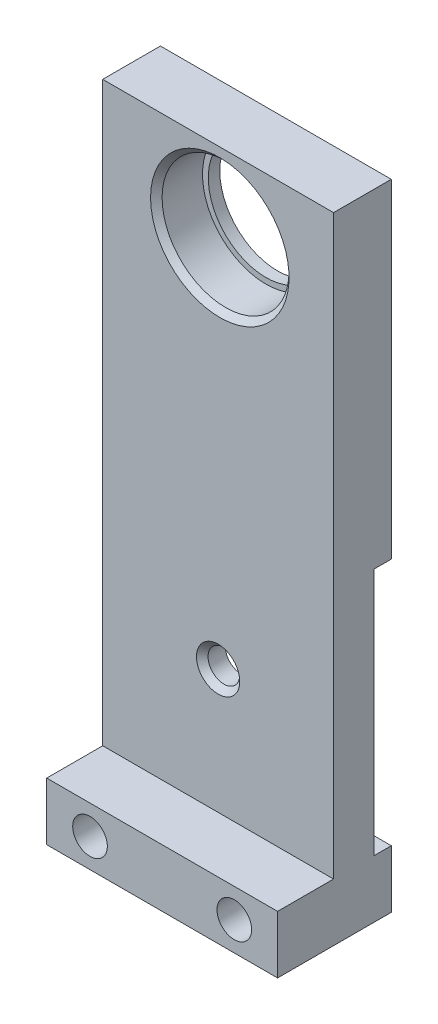
ISO-10303-21;
HEADER;
FILE_DESCRIPTION(('STEP AP214'),'2;1');
FILE_NAME('part.step','',(''),(''),'','','');
FILE_SCHEMA(('AUTOMOTIVE_DESIGN { 1 0 10303 214 1 1 1 1 }'));
ENDSEC;
DATA;
#1=APPLICATION_CONTEXT('core data for automotive mechanical design processes');
#2=APPLICATION_PROTOCOL_DEFINITION('international standard','automotive_design',2000,#1);
#3=PRODUCT_CONTEXT('',#1,'mechanical');
#4=PRODUCT('Part','Part','',(#3));
#5=PRODUCT_RELATED_PRODUCT_CATEGORY('part','',(#4));
#6=PRODUCT_DEFINITION_FORMATION('','',#4);
#7=PRODUCT_DEFINITION_CONTEXT('part definition',#1,'design');
#8=PRODUCT_DEFINITION('design','',#6,#7);
#9=PRODUCT_DEFINITION_SHAPE('','',#8);
#10=(LENGTH_UNIT() NAMED_UNIT(*) SI_UNIT(.MILLI.,.METRE.));
#11=(NAMED_UNIT(*) PLANE_ANGLE_UNIT() SI_UNIT($,.RADIAN.));
#12=(NAMED_UNIT(*) SI_UNIT($,.STERADIAN.) SOLID_ANGLE_UNIT());
#13=UNCERTAINTY_MEASURE_WITH_UNIT(LENGTH_MEASURE(1.E-05),#10,'distance_accuracy_value','');
#14=(GEOMETRIC_REPRESENTATION_CONTEXT(3) GLOBAL_UNCERTAINTY_ASSIGNED_CONTEXT((#13)) GLOBAL_UNIT_ASSIGNED_CONTEXT((#10,
#11,#12)) REPRESENTATION_CONTEXT('',''));
#15=CARTESIAN_POINT('',(0.,0.,0.));
#16=DIRECTION('',(0.,0.,1.));
#17=DIRECTION('',(1.,0.,0.));
#18=AXIS2_PLACEMENT_3D('',#15,#16,#17);
#19=CARTESIAN_POINT('',(20.,31.5,14.));
#20=DIRECTION('',(0.,0.,-1.));
#21=DIRECTION('',(-1.,0.,0.));
#22=AXIS2_PLACEMENT_3D('',#19,#20,#21);
#23=CYLINDRICAL_SURFACE('',#22,2.75);
#24=CARTESIAN_POINT('',(20.,31.5,9.00000000000003));
#25=DIRECTION('',(0.,0.,-1.));
#26=DIRECTION('',(-1.,0.,0.));
#27=AXIS2_PLACEMENT_3D('',#24,#25,#26);
#28=CIRCLE('',#27,2.75);
#29=CARTESIAN_POINT('',(17.25,31.5,9.00000000000003));
#30=VERTEX_POINT('',#29);
#31=EDGE_CURVE('E55',#30,#30,#28,.F.);
#32=ORIENTED_EDGE('',*,*,#31,.T.);
#33=EDGE_LOOP('',(#32));
#34=FACE_BOUND('',#33,.T.);
#35=CARTESIAN_POINT('',(20.,31.5,6.));
#36=DIRECTION('',(0.,0.,-1.));
#37=DIRECTION('',(-1.,0.,0.));
#38=AXIS2_PLACEMENT_3D('',#35,#36,#37);
#39=CIRCLE('',#38,2.75);
#40=CARTESIAN_POINT('',(17.25,31.5,6.));
#41=VERTEX_POINT('',#40);
#42=EDGE_CURVE('E49',#41,#41,#39,.F.);
#43=ORIENTED_EDGE('',*,*,#42,.F.);
#44=EDGE_LOOP('',(#43));
#45=FACE_BOUND('',#44,.T.);
#46=ADVANCED_FACE('F44',(#34,#45),#23,.F.);
#47=CARTESIAN_POINT('',(7.5,5.,21.));
#48=DIRECTION('',(0.,0.,-1.));
#49=DIRECTION('',(-1.,0.,0.));
#50=AXIS2_PLACEMENT_3D('',#47,#48,#49);
#51=CYLINDRICAL_SURFACE('',#50,3.);
#52=CARTESIAN_POINT('',(7.5,5.,19.7));
#53=DIRECTION('',(0.,0.,-1.));
#54=DIRECTION('',(-1.,0.,0.));
#55=AXIS2_PLACEMENT_3D('',#52,#53,#54);
#56=CIRCLE('',#55,3.);
#57=CARTESIAN_POINT('',(4.5,5.,19.7));
#58=VERTEX_POINT('',#57);
#59=EDGE_CURVE('E262',#58,#58,#56,.T.);
#60=ORIENTED_EDGE('',*,*,#59,.F.);
#61=EDGE_LOOP('',(#60));
#62=FACE_BOUND('',#61,.T.);
#63=CARTESIAN_POINT('',(7.5,5.,13.));
#64=DIRECTION('',(0.,0.,-1.));
#65=DIRECTION('',(-1.,0.,0.));
#66=AXIS2_PLACEMENT_3D('',#63,#64,#65);
#67=CIRCLE('',#66,3.);
#68=CARTESIAN_POINT('',(4.5,5.,13.));
#69=VERTEX_POINT('',#68);
#70=EDGE_CURVE('E266',#69,#69,#67,.F.);
#71=ORIENTED_EDGE('',*,*,#70,.F.);
#72=EDGE_LOOP('',(#71));
#73=FACE_BOUND('',#72,.T.);
#74=ADVANCED_FACE('F280',(#62,#73),#51,.F.);
#75=CARTESIAN_POINT('',(32.5,5.,21.));
#76=DIRECTION('',(0.,0.,-1.));
#77=DIRECTION('',(-1.,0.,0.));
#78=AXIS2_PLACEMENT_3D('',#75,#76,#77);
#79=CYLINDRICAL_SURFACE('',#78,3.);
#80=CARTESIAN_POINT('',(32.5,5.,19.7));
#81=DIRECTION('',(0.,0.,-1.));
#82=DIRECTION('',(-1.,0.,0.));
#83=AXIS2_PLACEMENT_3D('',#80,#81,#82);
#84=CIRCLE('',#83,3.);
#85=CARTESIAN_POINT('',(29.5,5.,19.7));
#86=VERTEX_POINT('',#85);
#87=EDGE_CURVE('E157',#86,#86,#84,.T.);
#88=ORIENTED_EDGE('',*,*,#87,.F.);
#89=EDGE_LOOP('',(#88));
#90=FACE_BOUND('',#89,.T.);
#91=CARTESIAN_POINT('',(32.5,5.,13.));
#92=DIRECTION('',(0.,0.,-1.));
#93=DIRECTION('',(-1.,0.,0.));
#94=AXIS2_PLACEMENT_3D('',#91,#92,#93);
#95=CIRCLE('',#94,3.);
#96=CARTESIAN_POINT('',(29.5,5.,13.));
#97=VERTEX_POINT('',#96);
#98=EDGE_CURVE('E270',#97,#97,#95,.F.);
#99=ORIENTED_EDGE('',*,*,#98,.F.);
#100=EDGE_LOOP('',(#99));
#101=FACE_BOUND('',#100,.T.);
#102=ADVANCED_FACE('F282',(#90,#101),#79,.F.);
#103=CARTESIAN_POINT('',(0.,0.,10.));
#104=DIRECTION('',(0.,0.,-1.));
#105=DIRECTION('',(-1.,0.,0.));
#106=AXIS2_PLACEMENT_3D('',#103,#104,#105);
#107=PLANE('',#106);
#108=CARTESIAN_POINT('',(20.2904559974548,96.4,10.));
#109=DIRECTION('',(0.,0.,-1.));
#110=DIRECTION('',(-1.,0.,0.));
#111=AXIS2_PLACEMENT_3D('',#108,#109,#110);
#112=CIRCLE('',#111,12.);
#113=CARTESIAN_POINT('',(8.29045599745482,96.4,10.));
#114=VERTEX_POINT('',#113);
#115=EDGE_CURVE('E138',#114,#114,#112,.T.);
#116=ORIENTED_EDGE('',*,*,#115,.T.);
#117=EDGE_LOOP('',(#116));
#118=FACE_BOUND('',#117,.T.);
#119=CARTESIAN_POINT('',(20.,31.5,10.));
#120=DIRECTION('',(0.,0.,-1.));
#121=DIRECTION('',(-1.,0.,0.));
#122=AXIS2_PLACEMENT_3D('',#119,#120,#121);
#123=CIRCLE('',#122,3.74999999999996);
#124=CARTESIAN_POINT('',(16.25,31.5,10.));
#125=VERTEX_POINT('',#124);
#126=EDGE_CURVE('E255',#125,#125,#123,.T.);
#127=ORIENTED_EDGE('',*,*,#126,.T.);
#128=EDGE_LOOP('',(#127));
#129=FACE_BOUND('',#128,.T.);
#130=DIRECTION('',(-1.,0.,0.));
#131=VECTOR('',#130,1.);
#132=CARTESIAN_POINT('',(0.,10.,10.));
#133=LINE('',#132,#131);
#134=CARTESIAN_POINT('',(40.,10.,10.));
#135=VERTEX_POINT('',#134);
#136=CARTESIAN_POINT('',(0.,10.,10.));
#137=VERTEX_POINT('',#136);
#138=EDGE_CURVE('E63',#135,#137,#133,.T.);
#139=ORIENTED_EDGE('',*,*,#138,.F.);
#140=DIRECTION('',(0.,1.,0.));
#141=VECTOR('',#140,1.);
#142=CARTESIAN_POINT('',(40.,0.,10.));
#143=LINE('',#142,#141);
#144=CARTESIAN_POINT('',(40.,110.,10.));
#145=VERTEX_POINT('',#144);
#146=EDGE_CURVE('E219',#135,#145,#143,.T.);
#147=ORIENTED_EDGE('',*,*,#146,.T.);
#148=DIRECTION('',(-1.,0.,0.));
#149=VECTOR('',#148,1.);
#150=CARTESIAN_POINT('',(0.,110.,10.));
#151=LINE('',#150,#149);
#152=CARTESIAN_POINT('',(0.,110.,10.));
#153=VERTEX_POINT('',#152);
#154=EDGE_CURVE('E223',#145,#153,#151,.T.);
#155=ORIENTED_EDGE('',*,*,#154,.T.);
#156=DIRECTION('',(0.,-1.,0.));
#157=VECTOR('',#156,1.);
#158=CARTESIAN_POINT('',(0.,0.,10.));
#159=LINE('',#158,#157);
#160=EDGE_CURVE('E216',#153,#137,#159,.T.);
#161=ORIENTED_EDGE('',*,*,#160,.T.);
#162=EDGE_LOOP('',(#139,#147,#155,#161));
#163=FACE_BOUND('',#162,.T.);
#164=ADVANCED_FACE('F289',(#118,#129,#163),#107,.F.);
#165=CARTESIAN_POINT('',(0.,0.,0.));
#166=DIRECTION('',(0.,0.,-1.));
#167=DIRECTION('',(-1.,0.,0.));
#168=AXIS2_PLACEMENT_3D('',#165,#166,#167);
#169=PLANE('',#168);
#170=CARTESIAN_POINT('',(20.2904559974548,96.4,0.));
#171=DIRECTION('',(0.,0.,-1.));
#172=DIRECTION('',(-1.,0.,0.));
#173=AXIS2_PLACEMENT_3D('',#170,#171,#172);
#174=CIRCLE('',#173,10.);
#175=CARTESIAN_POINT('',(10.2904559974548,96.4,0.));
#176=VERTEX_POINT('',#175);
#177=EDGE_CURVE('E178',#176,#176,#174,.T.);
#178=ORIENTED_EDGE('',*,*,#177,.F.);
#179=EDGE_LOOP('',(#178));
#180=FACE_BOUND('',#179,.T.);
#181=DIRECTION('',(1.,0.,0.));
#182=VECTOR('',#181,1.);
#183=CARTESIAN_POINT('',(40.,53.,0.));
#184=LINE('',#183,#182);
#185=CARTESIAN_POINT('',(0.,53.,0.));
#186=VERTEX_POINT('',#185);
#187=CARTESIAN_POINT('',(40.,53.,0.));
#188=VERTEX_POINT('',#187);
#189=EDGE_CURVE('E189',#186,#188,#184,.T.);
#190=ORIENTED_EDGE('',*,*,#189,.F.);
#191=DIRECTION('',(0.,-1.,0.));
#192=VECTOR('',#191,1.);
#193=CARTESIAN_POINT('',(0.,0.,0.));
#194=LINE('',#193,#192);
#195=CARTESIAN_POINT('',(0.,110.,0.));
#196=VERTEX_POINT('',#195);
#197=EDGE_CURVE('E227',#196,#186,#194,.T.);
#198=ORIENTED_EDGE('',*,*,#197,.F.);
#199=DIRECTION('',(-1.,0.,0.));
#200=VECTOR('',#199,1.);
#201=CARTESIAN_POINT('',(0.,110.,0.));
#202=LINE('',#201,#200);
#203=CARTESIAN_POINT('',(40.,110.,0.));
#204=VERTEX_POINT('',#203);
#205=EDGE_CURVE('E220',#204,#196,#202,.T.);
#206=ORIENTED_EDGE('',*,*,#205,.F.);
#207=DIRECTION('',(0.,1.,0.));
#208=VECTOR('',#207,1.);
#209=CARTESIAN_POINT('',(40.,0.,0.));
#210=LINE('',#209,#208);
#211=EDGE_CURVE('E233',#188,#204,#210,.T.);
#212=ORIENTED_EDGE('',*,*,#211,.F.);
#213=EDGE_LOOP('',(#190,#198,#206,#212));
#214=FACE_BOUND('',#213,.T.);
#215=ADVANCED_FACE('F332',(#180,#214),#169,.T.);
#216=CARTESIAN_POINT('',(0.,0.,10.));
#217=DIRECTION('',(1.,0.,0.));
#218=DIRECTION('',(0.,0.,-1.));
#219=AXIS2_PLACEMENT_3D('',#216,#217,#218);
#220=PLANE('',#219);
#221=ORIENTED_EDGE('',*,*,#197,.T.);
#222=DIRECTION('',(0.,0.,-1.));
#223=VECTOR('',#222,1.);
#224=CARTESIAN_POINT('',(0.,53.,3.));
#225=LINE('',#224,#223);
#226=CARTESIAN_POINT('',(0.,53.,3.));
#227=VERTEX_POINT('',#226);
#228=EDGE_CURVE('E208',#227,#186,#225,.T.);
#229=ORIENTED_EDGE('',*,*,#228,.F.);
#230=DIRECTION('',(0.,1.,0.));
#231=VECTOR('',#230,1.);
#232=CARTESIAN_POINT('',(0.,10.,3.));
#233=LINE('',#232,#231);
#234=CARTESIAN_POINT('',(0.,10.,3.));
#235=VERTEX_POINT('',#234);
#236=EDGE_CURVE('E193',#235,#227,#233,.T.);
#237=ORIENTED_EDGE('',*,*,#236,.F.);
#238=DIRECTION('',(0.,0.,-1.));
#239=VECTOR('',#238,1.);
#240=CARTESIAN_POINT('',(0.,10.,3.));
#241=LINE('',#240,#239);
#242=CARTESIAN_POINT('',(0.,10.,0.));
#243=VERTEX_POINT('',#242);
#244=EDGE_CURVE('E211',#235,#243,#241,.T.);
#245=ORIENTED_EDGE('',*,*,#244,.T.);
#246=CARTESIAN_POINT('',(0.,0.,0.));
#247=VERTEX_POINT('',#246);
#248=EDGE_CURVE('E134',#243,#247,#194,.T.);
#249=ORIENTED_EDGE('',*,*,#248,.T.);
#250=DIRECTION('',(0.,0.,-1.));
#251=VECTOR('',#250,1.);
#252=CARTESIAN_POINT('',(0.,0.,10.));
#253=LINE('',#252,#251);
#254=CARTESIAN_POINT('',(0.,0.,19.7));
#255=VERTEX_POINT('',#254);
#256=EDGE_CURVE('E125',#255,#247,#253,.T.);
#257=ORIENTED_EDGE('',*,*,#256,.F.);
#258=DIRECTION('',(0.,-1.,0.));
#259=VECTOR('',#258,1.);
#260=CARTESIAN_POINT('',(0.,0.,19.7));
#261=LINE('',#260,#259);
#262=CARTESIAN_POINT('',(0.,10.,19.7));
#263=VERTEX_POINT('',#262);
#264=EDGE_CURVE('E131',#263,#255,#261,.T.);
#265=ORIENTED_EDGE('',*,*,#264,.F.);
#266=DIRECTION('',(0.,0.,-1.));
#267=VECTOR('',#266,1.);
#268=CARTESIAN_POINT('',(0.,10.,19.7));
#269=LINE('',#268,#267);
#270=EDGE_CURVE('E166',#263,#137,#269,.T.);
#271=ORIENTED_EDGE('',*,*,#270,.T.);
#272=ORIENTED_EDGE('',*,*,#160,.F.);
#273=DIRECTION('',(0.,0.,-1.));
#274=VECTOR('',#273,1.);
#275=CARTESIAN_POINT('',(0.,110.,10.));
#276=LINE('',#275,#274);
#277=EDGE_CURVE('E226',#153,#196,#276,.T.);
#278=ORIENTED_EDGE('',*,*,#277,.T.);
#279=EDGE_LOOP('',(#221,#229,#237,#245,#249,#257,#265,#271,#272,#278));
#280=FACE_BOUND('',#279,.T.);
#281=ADVANCED_FACE('F128',(#280),#220,.F.);
#282=CARTESIAN_POINT('',(0.,0.,10.));
#283=DIRECTION('',(0.,1.,0.));
#284=DIRECTION('',(0.,0.,1.));
#285=AXIS2_PLACEMENT_3D('',#282,#283,#284);
#286=PLANE('',#285);
#287=DIRECTION('',(1.,0.,0.));
#288=VECTOR('',#287,1.);
#289=CARTESIAN_POINT('',(0.,0.,0.));
#290=LINE('',#289,#288);
#291=CARTESIAN_POINT('',(40.,0.,0.));
#292=VERTEX_POINT('',#291);
#293=EDGE_CURVE('E230',#247,#292,#290,.T.);
#294=ORIENTED_EDGE('',*,*,#293,.T.);
#295=DIRECTION('',(0.,0.,-1.));
#296=VECTOR('',#295,1.);
#297=CARTESIAN_POINT('',(40.,0.,10.));
#298=LINE('',#297,#296);
#299=CARTESIAN_POINT('',(40.,0.,19.7));
#300=VERTEX_POINT('',#299);
#301=EDGE_CURVE('E139',#300,#292,#298,.T.);
#302=ORIENTED_EDGE('',*,*,#301,.F.);
#303=DIRECTION('',(1.,0.,0.));
#304=VECTOR('',#303,1.);
#305=CARTESIAN_POINT('',(0.,0.,19.7));
#306=LINE('',#305,#304);
#307=EDGE_CURVE('E142',#255,#300,#306,.T.);
#308=ORIENTED_EDGE('',*,*,#307,.F.);
#309=ORIENTED_EDGE('',*,*,#256,.T.);
#310=EDGE_LOOP('',(#294,#302,#308,#309));
#311=FACE_BOUND('',#310,.T.);
#312=ADVANCED_FACE('F143',(#311),#286,.F.);
#313=CARTESIAN_POINT('',(40.,0.,10.));
#314=DIRECTION('',(-1.,0.,0.));
#315=DIRECTION('',(0.,0.,1.));
#316=AXIS2_PLACEMENT_3D('',#313,#314,#315);
#317=PLANE('',#316);
#318=DIRECTION('',(0.,-1.,0.));
#319=VECTOR('',#318,1.);
#320=CARTESIAN_POINT('',(40.,10.,3.));
#321=LINE('',#320,#319);
#322=CARTESIAN_POINT('',(40.,53.,3.));
#323=VERTEX_POINT('',#322);
#324=CARTESIAN_POINT('',(40.,10.,3.));
#325=VERTEX_POINT('',#324);
#326=EDGE_CURVE('E184',#323,#325,#321,.T.);
#327=ORIENTED_EDGE('',*,*,#326,.F.);
#328=DIRECTION('',(0.,0.,-1.));
#329=VECTOR('',#328,1.);
#330=CARTESIAN_POINT('',(40.,53.,3.));
#331=LINE('',#330,#329);
#332=EDGE_CURVE('E204',#323,#188,#331,.T.);
#333=ORIENTED_EDGE('',*,*,#332,.T.);
#334=ORIENTED_EDGE('',*,*,#211,.T.);
#335=DIRECTION('',(0.,0.,-1.));
#336=VECTOR('',#335,1.);
#337=CARTESIAN_POINT('',(40.,110.,10.));
#338=LINE('',#337,#336);
#339=EDGE_CURVE('E243',#145,#204,#338,.T.);
#340=ORIENTED_EDGE('',*,*,#339,.F.);
#341=ORIENTED_EDGE('',*,*,#146,.F.);
#342=DIRECTION('',(0.,0.,-1.));
#343=VECTOR('',#342,1.);
#344=CARTESIAN_POINT('',(40.,10.,19.7));
#345=LINE('',#344,#343);
#346=CARTESIAN_POINT('',(40.,10.,19.7));
#347=VERTEX_POINT('',#346);
#348=EDGE_CURVE('E170',#347,#135,#345,.T.);
#349=ORIENTED_EDGE('',*,*,#348,.F.);
#350=DIRECTION('',(0.,1.,0.));
#351=VECTOR('',#350,1.);
#352=CARTESIAN_POINT('',(40.,0.,19.7));
#353=LINE('',#352,#351);
#354=EDGE_CURVE('E148',#300,#347,#353,.T.);
#355=ORIENTED_EDGE('',*,*,#354,.F.);
#356=ORIENTED_EDGE('',*,*,#301,.T.);
#357=CARTESIAN_POINT('',(40.,10.,0.));
#358=VERTEX_POINT('',#357);
#359=EDGE_CURVE('E234',#292,#358,#210,.T.);
#360=ORIENTED_EDGE('',*,*,#359,.T.);
#361=DIRECTION('',(0.,0.,-1.));
#362=VECTOR('',#361,1.);
#363=CARTESIAN_POINT('',(40.,10.,3.));
#364=LINE('',#363,#362);
#365=EDGE_CURVE('E71',#325,#358,#364,.T.);
#366=ORIENTED_EDGE('',*,*,#365,.F.);
#367=EDGE_LOOP('',(#327,#333,#334,#340,#341,#349,#355,#356,#360,#366));
#368=FACE_BOUND('',#367,.T.);
#369=ADVANCED_FACE('F340',(#368),#317,.F.);
#370=CARTESIAN_POINT('',(0.,110.,10.));
#371=DIRECTION('',(0.,-1.,0.));
#372=DIRECTION('',(0.,0.,-1.));
#373=AXIS2_PLACEMENT_3D('',#370,#371,#372);
#374=PLANE('',#373);
#375=ORIENTED_EDGE('',*,*,#205,.T.);
#376=ORIENTED_EDGE('',*,*,#277,.F.);
#377=ORIENTED_EDGE('',*,*,#154,.F.);
#378=ORIENTED_EDGE('',*,*,#339,.T.);
#379=EDGE_LOOP('',(#375,#376,#377,#378));
#380=FACE_BOUND('',#379,.T.);
#381=ADVANCED_FACE('F336',(#380),#374,.F.);
#382=CARTESIAN_POINT('',(32.5,5.,0.));
#383=DIRECTION('',(0.,0.,-1.));
#384=DIRECTION('',(-1.,0.,0.));
#385=AXIS2_PLACEMENT_3D('',#382,#383,#384);
#386=CIRCLE('',#385,4.5);
#387=CARTESIAN_POINT('',(28.,5.,0.));
#388=VERTEX_POINT('',#387);
#389=EDGE_CURVE('E383',#388,#388,#386,.T.);
#390=ORIENTED_EDGE('',*,*,#389,.F.);
#391=EDGE_LOOP('',(#390));
#392=FACE_BOUND('',#391,.T.);
#393=CARTESIAN_POINT('',(7.5,5.,0.));
#394=DIRECTION('',(0.,0.,-1.));
#395=DIRECTION('',(-1.,0.,0.));
#396=AXIS2_PLACEMENT_3D('',#393,#394,#395);
#397=CIRCLE('',#396,4.5);
#398=CARTESIAN_POINT('',(3.,5.,0.));
#399=VERTEX_POINT('',#398);
#400=EDGE_CURVE('E370',#399,#399,#397,.T.);
#401=ORIENTED_EDGE('',*,*,#400,.F.);
#402=EDGE_LOOP('',(#401));
#403=FACE_BOUND('',#402,.T.);
#404=DIRECTION('',(-1.,0.,0.));
#405=VECTOR('',#404,1.);
#406=CARTESIAN_POINT('',(40.,10.,0.));
#407=LINE('',#406,#405);
#408=EDGE_CURVE('E183',#358,#243,#407,.T.);
#409=ORIENTED_EDGE('',*,*,#408,.F.);
#410=ORIENTED_EDGE('',*,*,#359,.F.);
#411=ORIENTED_EDGE('',*,*,#293,.F.);
#412=ORIENTED_EDGE('',*,*,#248,.F.);
#413=EDGE_LOOP('',(#409,#410,#411,#412));
#414=FACE_BOUND('',#413,.T.);
#415=ADVANCED_FACE('F326',(#392,#403,#414),#169,.T.);
#416=CARTESIAN_POINT('',(40.,53.,3.));
#417=DIRECTION('',(0.,1.,0.));
#418=DIRECTION('',(0.,0.,1.));
#419=AXIS2_PLACEMENT_3D('',#416,#417,#418);
#420=PLANE('',#419);
#421=ORIENTED_EDGE('',*,*,#189,.T.);
#422=ORIENTED_EDGE('',*,*,#332,.F.);
#423=DIRECTION('',(1.,0.,0.));
#424=VECTOR('',#423,1.);
#425=CARTESIAN_POINT('',(40.,53.,3.));
#426=LINE('',#425,#424);
#427=EDGE_CURVE('E196',#227,#323,#426,.T.);
#428=ORIENTED_EDGE('',*,*,#427,.F.);
#429=ORIENTED_EDGE('',*,*,#228,.T.);
#430=EDGE_LOOP('',(#421,#422,#428,#429));
#431=FACE_BOUND('',#430,.T.);
#432=ADVANCED_FACE('F323',(#431),#420,.F.);
#433=CARTESIAN_POINT('',(40.,10.,3.));
#434=DIRECTION('',(0.,-1.,0.));
#435=DIRECTION('',(0.,0.,-1.));
#436=AXIS2_PLACEMENT_3D('',#433,#434,#435);
#437=PLANE('',#436);
#438=ORIENTED_EDGE('',*,*,#408,.T.);
#439=ORIENTED_EDGE('',*,*,#244,.F.);
#440=DIRECTION('',(-1.,0.,0.));
#441=VECTOR('',#440,1.);
#442=CARTESIAN_POINT('',(40.,10.,3.));
#443=LINE('',#442,#441);
#444=EDGE_CURVE('E188',#325,#235,#443,.T.);
#445=ORIENTED_EDGE('',*,*,#444,.F.);
#446=ORIENTED_EDGE('',*,*,#365,.T.);
#447=EDGE_LOOP('',(#438,#439,#445,#446));
#448=FACE_BOUND('',#447,.T.);
#449=ADVANCED_FACE('F321',(#448),#437,.F.);
#450=CARTESIAN_POINT('',(0.,0.,3.));
#451=DIRECTION('',(0.,0.,1.));
#452=DIRECTION('',(1.,0.,0.));
#453=AXIS2_PLACEMENT_3D('',#450,#451,#452);
#454=PLANE('',#453);
#455=CARTESIAN_POINT('',(20.,31.5,3.));
#456=DIRECTION('',(0.,0.,-1.));
#457=DIRECTION('',(-1.,0.,0.));
#458=AXIS2_PLACEMENT_3D('',#455,#456,#457);
#459=CIRCLE('',#458,11.25);
#460=CARTESIAN_POINT('',(8.75,31.5,3.));
#461=VERTEX_POINT('',#460);
#462=EDGE_CURVE('E372',#461,#461,#459,.T.);
#463=ORIENTED_EDGE('',*,*,#462,.F.);
#464=EDGE_LOOP('',(#463));
#465=FACE_BOUND('',#464,.T.);
#466=ORIENTED_EDGE('',*,*,#326,.T.);
#467=ORIENTED_EDGE('',*,*,#444,.T.);
#468=ORIENTED_EDGE('',*,*,#236,.T.);
#469=ORIENTED_EDGE('',*,*,#427,.T.);
#470=EDGE_LOOP('',(#466,#467,#468,#469));
#471=FACE_BOUND('',#470,.T.);
#472=ADVANCED_FACE('F316',(#465,#471),#454,.F.);
#473=CARTESIAN_POINT('',(20.2904559974548,96.4,2.));
#474=DIRECTION('',(0.,0.,1.));
#475=DIRECTION('',(1.,0.,0.));
#476=AXIS2_PLACEMENT_3D('',#473,#474,#475);
#477=CYLINDRICAL_SURFACE('',#476,11.);
#478=CARTESIAN_POINT('',(20.2904559974548,96.4,8.99999999999999));
#479=DIRECTION('',(0.,0.,-1.));
#480=DIRECTION('',(-1.,0.,0.));
#481=AXIS2_PLACEMENT_3D('',#478,#479,#480);
#482=CIRCLE('',#481,11.);
#483=CARTESIAN_POINT('',(9.29045599745483,96.4,8.99999999999999));
#484=VERTEX_POINT('',#483);
#485=EDGE_CURVE('E11',#484,#484,#482,.F.);
#486=ORIENTED_EDGE('',*,*,#485,.T.);
#487=EDGE_LOOP('',(#486));
#488=FACE_BOUND('',#487,.T.);
#489=CARTESIAN_POINT('',(20.2904559974548,96.4,2.));
#490=DIRECTION('',(0.,0.,1.));
#491=DIRECTION('',(1.,0.,0.));
#492=AXIS2_PLACEMENT_3D('',#489,#490,#491);
#493=CIRCLE('',#492,11.);
#494=CARTESIAN_POINT('',(31.2904559974548,96.4,2.));
#495=VERTEX_POINT('',#494);
#496=EDGE_CURVE('E179',#495,#495,#493,.T.);
#497=ORIENTED_EDGE('',*,*,#496,.F.);
#498=EDGE_LOOP('',(#497));
#499=FACE_BOUND('',#498,.T.);
#500=ADVANCED_FACE('F313',(#488,#499),#477,.F.);
#501=CARTESIAN_POINT('',(20.2904559974548,96.4,2.));
#502=DIRECTION('',(0.,0.,1.));
#503=DIRECTION('',(1.,0.,0.));
#504=AXIS2_PLACEMENT_3D('',#501,#502,#503);
#505=PLANE('',#504);
#506=CARTESIAN_POINT('',(20.2904559974548,96.4,2.));
#507=DIRECTION('',(0.,0.,1.));
#508=DIRECTION('',(1.,0.,0.));
#509=AXIS2_PLACEMENT_3D('',#506,#507,#508);
#510=CIRCLE('',#509,10.);
#511=CARTESIAN_POINT('',(30.2904559974548,96.4,2.));
#512=VERTEX_POINT('',#511);
#513=EDGE_CURVE('E174',#512,#512,#510,.T.);
#514=ORIENTED_EDGE('',*,*,#513,.F.);
#515=EDGE_LOOP('',(#514));
#516=FACE_BOUND('',#515,.T.);
#517=ORIENTED_EDGE('',*,*,#496,.T.);
#518=EDGE_LOOP('',(#517));
#519=FACE_BOUND('',#518,.T.);
#520=ADVANCED_FACE('F309',(#516,#519),#505,.T.);
#521=CARTESIAN_POINT('',(20.2904559974548,96.4,-6.));
#522=DIRECTION('',(0.,0.,1.));
#523=DIRECTION('',(1.,0.,0.));
#524=AXIS2_PLACEMENT_3D('',#521,#522,#523);
#525=CYLINDRICAL_SURFACE('',#524,10.);
#526=ORIENTED_EDGE('',*,*,#177,.T.);
#527=EDGE_LOOP('',(#526));
#528=FACE_BOUND('',#527,.T.);
#529=ORIENTED_EDGE('',*,*,#513,.T.);
#530=EDGE_LOOP('',(#529));
#531=FACE_BOUND('',#530,.T.);
#532=ADVANCED_FACE('F305',(#528,#531),#525,.F.);
#533=CARTESIAN_POINT('',(20.,31.5,10.));
#534=DIRECTION('',(0.,0.,1.));
#535=DIRECTION('',(1.,0.,0.));
#536=AXIS2_PLACEMENT_3D('',#533,#534,#535);
#537=CONICAL_SURFACE('',#536,3.74999999999996,0.785398163397447);
#538=ORIENTED_EDGE('',*,*,#31,.F.);
#539=EDGE_LOOP('',(#538));
#540=FACE_BOUND('',#539,.T.);
#541=ORIENTED_EDGE('',*,*,#126,.F.);
#542=EDGE_LOOP('',(#541));
#543=FACE_BOUND('',#542,.T.);
#544=ADVANCED_FACE('F308',(#540,#543),#537,.F.);
#545=CARTESIAN_POINT('',(20.2904559974548,96.4,8.99999999999999));
#546=DIRECTION('',(0.,0.,1.));
#547=DIRECTION('',(1.,0.,0.));
#548=AXIS2_PLACEMENT_3D('',#545,#546,#547);
#549=CONICAL_SURFACE('',#548,11.,0.78539816339745);
#550=ORIENTED_EDGE('',*,*,#115,.F.);
#551=EDGE_LOOP('',(#550));
#552=FACE_BOUND('',#551,.T.);
#553=ORIENTED_EDGE('',*,*,#485,.F.);
#554=EDGE_LOOP('',(#553));
#555=FACE_BOUND('',#554,.T.);
#556=ADVANCED_FACE('F47',(#552,#555),#549,.F.);
#557=CARTESIAN_POINT('',(0.,10.,19.7));
#558=DIRECTION('',(0.,-1.,0.));
#559=DIRECTION('',(0.,0.,-1.));
#560=AXIS2_PLACEMENT_3D('',#557,#558,#559);
#561=PLANE('',#560);
#562=ORIENTED_EDGE('',*,*,#138,.T.);
#563=ORIENTED_EDGE('',*,*,#270,.F.);
#564=DIRECTION('',(-1.,0.,0.));
#565=VECTOR('',#564,1.);
#566=CARTESIAN_POINT('',(0.,10.,19.7));
#567=LINE('',#566,#565);
#568=EDGE_CURVE('E152',#347,#263,#567,.T.);
#569=ORIENTED_EDGE('',*,*,#568,.F.);
#570=ORIENTED_EDGE('',*,*,#348,.T.);
#571=EDGE_LOOP('',(#562,#563,#569,#570));
#572=FACE_BOUND('',#571,.T.);
#573=ADVANCED_FACE('F300',(#572),#561,.F.);
#574=CARTESIAN_POINT('',(0.,0.,19.7));
#575=DIRECTION('',(0.,0.,-1.));
#576=DIRECTION('',(-1.,0.,0.));
#577=AXIS2_PLACEMENT_3D('',#574,#575,#576);
#578=PLANE('',#577);
#579=ORIENTED_EDGE('',*,*,#87,.T.);
#580=EDGE_LOOP('',(#579));
#581=FACE_BOUND('',#580,.T.);
#582=ORIENTED_EDGE('',*,*,#59,.T.);
#583=EDGE_LOOP('',(#582));
#584=FACE_BOUND('',#583,.T.);
#585=ORIENTED_EDGE('',*,*,#264,.T.);
#586=ORIENTED_EDGE('',*,*,#307,.T.);
#587=ORIENTED_EDGE('',*,*,#354,.T.);
#588=ORIENTED_EDGE('',*,*,#568,.T.);
#589=EDGE_LOOP('',(#585,#586,#587,#588));
#590=FACE_BOUND('',#589,.T.);
#591=ADVANCED_FACE('F150',(#581,#584,#590),#578,.F.);
#592=CARTESIAN_POINT('',(32.5,5.,13.));
#593=DIRECTION('',(0.,0.,-1.));
#594=DIRECTION('',(-1.,0.,0.));
#595=AXIS2_PLACEMENT_3D('',#592,#593,#594);
#596=PLANE('',#595);
#597=CARTESIAN_POINT('',(32.5,5.,13.));
#598=DIRECTION('',(0.,0.,-1.));
#599=DIRECTION('',(-1.,0.,0.));
#600=AXIS2_PLACEMENT_3D('',#597,#598,#599);
#601=CIRCLE('',#600,4.5);
#602=CARTESIAN_POINT('',(28.,5.,13.));
#603=VERTEX_POINT('',#602);
#604=EDGE_CURVE('E273',#603,#603,#601,.T.);
#605=ORIENTED_EDGE('',*,*,#604,.T.);
#606=EDGE_LOOP('',(#605));
#607=FACE_BOUND('',#606,.T.);
#608=ORIENTED_EDGE('',*,*,#98,.T.);
#609=EDGE_LOOP('',(#608));
#610=FACE_BOUND('',#609,.T.);
#611=ADVANCED_FACE('F299',(#607,#610),#596,.T.);
#612=CARTESIAN_POINT('',(32.5,5.,13.));
#613=DIRECTION('',(0.,0.,-1.));
#614=DIRECTION('',(-1.,0.,0.));
#615=AXIS2_PLACEMENT_3D('',#612,#613,#614);
#616=CYLINDRICAL_SURFACE('',#615,4.5);
#617=CARTESIAN_POINT('',(28.,5.,13.));
#618=CARTESIAN_POINT('',(28.,5.,12.8645833333333));
#619=CARTESIAN_POINT('',(28.,5.,12.7291666666667));
#620=CARTESIAN_POINT('',(28.,5.,12.4583333333333));
#621=CARTESIAN_POINT('',(28.,5.,12.3229166666667));
#622=CARTESIAN_POINT('',(28.,5.,12.0520833333333));
#623=CARTESIAN_POINT('',(28.,5.,11.9166666666667));
#624=CARTESIAN_POINT('',(28.,5.,11.6458333333333));
#625=CARTESIAN_POINT('',(28.,5.,11.5104166666667));
#626=CARTESIAN_POINT('',(28.,5.,11.2395833333333));
#627=CARTESIAN_POINT('',(28.,5.,11.1041666666667));
#628=CARTESIAN_POINT('',(28.,5.,10.8333333333333));
#629=CARTESIAN_POINT('',(28.,5.,10.6979166666667));
#630=CARTESIAN_POINT('',(28.,5.,10.4270833333333));
#631=CARTESIAN_POINT('',(28.,5.,10.2916666666667));
#632=CARTESIAN_POINT('',(28.,5.,10.0208333333333));
#633=CARTESIAN_POINT('',(28.,5.,9.88541666666667));
#634=CARTESIAN_POINT('',(28.,5.,9.61458333333333));
#635=CARTESIAN_POINT('',(28.,5.,9.47916666666667));
#636=CARTESIAN_POINT('',(28.,5.,9.20833333333333));
#637=CARTESIAN_POINT('',(28.,5.,9.07291666666667));
#638=CARTESIAN_POINT('',(28.,5.,8.80208333333333));
#639=CARTESIAN_POINT('',(28.,5.,8.66666666666667));
#640=CARTESIAN_POINT('',(28.,5.,8.39583333333333));
#641=CARTESIAN_POINT('',(28.,5.,8.26041666666667));
#642=CARTESIAN_POINT('',(28.,5.,7.98958333333333));
#643=CARTESIAN_POINT('',(28.,5.,7.85416666666667));
#644=CARTESIAN_POINT('',(28.,5.,7.58333333333333));
#645=CARTESIAN_POINT('',(28.,5.,7.44791666666667));
#646=CARTESIAN_POINT('',(28.,5.,7.17708333333333));
#647=CARTESIAN_POINT('',(28.,5.,7.04166666666667));
#648=CARTESIAN_POINT('',(28.,5.,6.77083333333333));
#649=CARTESIAN_POINT('',(28.,5.,6.63541666666667));
#650=CARTESIAN_POINT('',(28.,5.,6.36458333333333));
#651=CARTESIAN_POINT('',(28.,5.,6.22916666666667));
#652=CARTESIAN_POINT('',(28.,5.,5.95833333333333));
#653=CARTESIAN_POINT('',(28.,5.,5.82291666666667));
#654=CARTESIAN_POINT('',(28.,5.,5.55208333333333));
#655=CARTESIAN_POINT('',(28.,5.,5.41666666666667));
#656=CARTESIAN_POINT('',(28.,5.,5.14583333333333));
#657=CARTESIAN_POINT('',(28.,5.,5.01041666666667));
#658=CARTESIAN_POINT('',(28.,5.,4.73958333333333));
#659=CARTESIAN_POINT('',(28.,5.,4.60416666666667));
#660=CARTESIAN_POINT('',(28.,5.,4.33333333333333));
#661=CARTESIAN_POINT('',(28.,5.,4.19791666666667));
#662=CARTESIAN_POINT('',(28.,5.,3.92708333333333));
#663=CARTESIAN_POINT('',(28.,5.,3.79166666666667));
#664=CARTESIAN_POINT('',(28.,5.,3.52083333333333));
#665=CARTESIAN_POINT('',(28.,5.,3.38541666666667));
#666=CARTESIAN_POINT('',(28.,5.,3.11458333333333));
#667=CARTESIAN_POINT('',(28.,5.,2.97916666666667));
#668=CARTESIAN_POINT('',(28.,5.,2.70833333333333));
#669=CARTESIAN_POINT('',(28.,5.,2.57291666666667));
#670=CARTESIAN_POINT('',(28.,5.,2.30208333333333));
#671=CARTESIAN_POINT('',(28.,5.,2.16666666666667));
#672=CARTESIAN_POINT('',(28.,5.,1.89583333333333));
#673=CARTESIAN_POINT('',(28.,5.,1.76041666666667));
#674=CARTESIAN_POINT('',(28.,5.,1.48958333333333));
#675=CARTESIAN_POINT('',(28.,5.,1.35416666666667));
#676=CARTESIAN_POINT('',(28.,5.,1.08333333333333));
#677=CARTESIAN_POINT('',(28.,5.,0.947916666666667));
#678=CARTESIAN_POINT('',(28.,5.,0.677083333333334));
#679=CARTESIAN_POINT('',(28.,5.,0.541666666666667));
#680=CARTESIAN_POINT('',(28.,5.,0.270833333333334));
#681=CARTESIAN_POINT('',(28.,5.,0.135416666666667));
#682=CARTESIAN_POINT('',(28.,5.,0.));
#683=B_SPLINE_CURVE_WITH_KNOTS('',3,(#617,#618,#619,#620,#621,#622,#623,#624,#625,#626,#627,
#628,#629,#630,#631,#632,#633,#634,#635,#636,#637,#638,#639,#640,#641,#642,#643,#644,#645,#646,
#647,#648,#649,#650,#651,#652,#653,#654,#655,#656,#657,#658,#659,#660,#661,#662,#663,#664,#665,
#666,#667,#668,#669,#670,#671,#672,#673,#674,#675,#676,#677,#678,#679,#680,#681,#682),
.UNSPECIFIED.,.F.,.F.,(4,2,2,2,2,2,2,2,2,2,2,2,2,2,2,2,2,2,2,2,2,2,2,2,2,2,2,2,2,2,2,2,4),(0.,
0.406249999999999,0.812499999999999,1.21875,1.625,2.03125,2.4375,2.84375,3.25,3.65625,4.0625,
4.46875,4.875,5.28125,5.6875,6.09375,6.5,6.90625,7.3125,7.71875,8.125,8.53125,8.9375,9.34375,
9.75,10.15625,10.5625,10.96875,11.375,11.78125,12.1875,12.59375,13.),.UNSPECIFIED.);
#684=EDGE_CURVE('BSEAM546',#603,#388,#683,.T.);
#685=ORIENTED_EDGE('',*,*,#604,.F.);
#686=ORIENTED_EDGE('',*,*,#389,.T.);
#687=ORIENTED_EDGE('',*,*,#684,.T.);
#688=ORIENTED_EDGE('',*,*,#684,.F.);
#689=EDGE_LOOP('',(#685,#687,#686,#688));
#690=FACE_BOUND('',#689,.T.);
#691=ADVANCED_FACE('F546',(#690),#616,.F.);
#692=CARTESIAN_POINT('',(7.5,5.,13.));
#693=DIRECTION('',(0.,0.,-1.));
#694=DIRECTION('',(-1.,0.,0.));
#695=AXIS2_PLACEMENT_3D('',#692,#693,#694);
#696=PLANE('',#695);
#697=CARTESIAN_POINT('',(7.5,5.,13.));
#698=DIRECTION('',(0.,0.,-1.));
#699=DIRECTION('',(-1.,0.,0.));
#700=AXIS2_PLACEMENT_3D('',#697,#698,#699);
#701=CIRCLE('',#700,4.5);
#702=CARTESIAN_POINT('',(3.,5.,13.));
#703=VERTEX_POINT('',#702);
#704=EDGE_CURVE('E160',#703,#703,#701,.T.);
#705=ORIENTED_EDGE('',*,*,#704,.T.);
#706=EDGE_LOOP('',(#705));
#707=FACE_BOUND('',#706,.T.);
#708=ORIENTED_EDGE('',*,*,#70,.T.);
#709=EDGE_LOOP('',(#708));
#710=FACE_BOUND('',#709,.T.);
#711=ADVANCED_FACE('F278',(#707,#710),#696,.T.);
#712=CARTESIAN_POINT('',(7.5,5.,13.));
#713=DIRECTION('',(0.,0.,-1.));
#714=DIRECTION('',(-1.,0.,0.));
#715=AXIS2_PLACEMENT_3D('',#712,#713,#714);
#716=CYLINDRICAL_SURFACE('',#715,4.5);
#717=CARTESIAN_POINT('',(3.,5.,13.));
#718=CARTESIAN_POINT('',(3.,5.,12.8645833333333));
#719=CARTESIAN_POINT('',(3.,5.,12.7291666666667));
#720=CARTESIAN_POINT('',(3.,5.,12.4583333333333));
#721=CARTESIAN_POINT('',(3.,5.,12.3229166666667));
#722=CARTESIAN_POINT('',(3.,5.,12.0520833333333));
#723=CARTESIAN_POINT('',(3.,5.,11.9166666666667));
#724=CARTESIAN_POINT('',(3.,5.,11.6458333333333));
#725=CARTESIAN_POINT('',(3.,5.,11.5104166666667));
#726=CARTESIAN_POINT('',(3.,5.,11.2395833333333));
#727=CARTESIAN_POINT('',(3.,5.,11.1041666666667));
#728=CARTESIAN_POINT('',(3.,5.,10.8333333333333));
#729=CARTESIAN_POINT('',(3.,5.,10.6979166666667));
#730=CARTESIAN_POINT('',(3.,5.,10.4270833333333));
#731=CARTESIAN_POINT('',(3.,5.,10.2916666666667));
#732=CARTESIAN_POINT('',(3.,5.,10.0208333333333));
#733=CARTESIAN_POINT('',(3.,5.,9.88541666666667));
#734=CARTESIAN_POINT('',(3.,5.,9.61458333333333));
#735=CARTESIAN_POINT('',(3.,5.,9.47916666666667));
#736=CARTESIAN_POINT('',(3.,5.,9.20833333333333));
#737=CARTESIAN_POINT('',(3.,5.,9.07291666666667));
#738=CARTESIAN_POINT('',(3.,5.,8.80208333333333));
#739=CARTESIAN_POINT('',(3.,5.,8.66666666666667));
#740=CARTESIAN_POINT('',(3.,5.,8.39583333333333));
#741=CARTESIAN_POINT('',(3.,5.,8.26041666666667));
#742=CARTESIAN_POINT('',(3.,5.,7.98958333333333));
#743=CARTESIAN_POINT('',(3.,5.,7.85416666666667));
#744=CARTESIAN_POINT('',(3.,5.,7.58333333333333));
#745=CARTESIAN_POINT('',(3.,5.,7.44791666666667));
#746=CARTESIAN_POINT('',(3.,5.,7.17708333333333));
#747=CARTESIAN_POINT('',(3.,5.,7.04166666666667));
#748=CARTESIAN_POINT('',(3.,5.,6.77083333333333));
#749=CARTESIAN_POINT('',(3.,5.,6.63541666666667));
#750=CARTESIAN_POINT('',(3.,5.,6.36458333333333));
#751=CARTESIAN_POINT('',(3.,5.,6.22916666666667));
#752=CARTESIAN_POINT('',(3.,5.,5.95833333333333));
#753=CARTESIAN_POINT('',(3.,5.,5.82291666666667));
#754=CARTESIAN_POINT('',(3.,5.,5.55208333333333));
#755=CARTESIAN_POINT('',(3.,5.,5.41666666666667));
#756=CARTESIAN_POINT('',(3.,5.,5.14583333333333));
#757=CARTESIAN_POINT('',(3.,5.,5.01041666666667));
#758=CARTESIAN_POINT('',(3.,5.,4.73958333333333));
#759=CARTESIAN_POINT('',(3.,5.,4.60416666666667));
#760=CARTESIAN_POINT('',(3.,5.,4.33333333333333));
#761=CARTESIAN_POINT('',(3.,5.,4.19791666666667));
#762=CARTESIAN_POINT('',(3.,5.,3.92708333333333));
#763=CARTESIAN_POINT('',(3.,5.,3.79166666666667));
#764=CARTESIAN_POINT('',(3.,5.,3.52083333333333));
#765=CARTESIAN_POINT('',(3.,5.,3.38541666666667));
#766=CARTESIAN_POINT('',(3.,5.,3.11458333333333));
#767=CARTESIAN_POINT('',(3.,5.,2.97916666666667));
#768=CARTESIAN_POINT('',(3.,5.,2.70833333333333));
#769=CARTESIAN_POINT('',(3.,5.,2.57291666666667));
#770=CARTESIAN_POINT('',(3.,5.,2.30208333333333));
#771=CARTESIAN_POINT('',(3.,5.,2.16666666666667));
#772=CARTESIAN_POINT('',(3.,5.,1.89583333333333));
#773=CARTESIAN_POINT('',(3.,5.,1.76041666666667));
#774=CARTESIAN_POINT('',(3.,5.,1.48958333333333));
#775=CARTESIAN_POINT('',(3.,5.,1.35416666666667));
#776=CARTESIAN_POINT('',(3.,5.,1.08333333333333));
#777=CARTESIAN_POINT('',(3.,5.,0.947916666666667));
#778=CARTESIAN_POINT('',(3.,5.,0.677083333333334));
#779=CARTESIAN_POINT('',(3.,5.,0.541666666666667));
#780=CARTESIAN_POINT('',(3.,5.,0.270833333333334));
#781=CARTESIAN_POINT('',(3.,5.,0.135416666666667));
#782=CARTESIAN_POINT('',(3.,5.,0.));
#783=B_SPLINE_CURVE_WITH_KNOTS('',3,(#717,#718,#719,#720,#721,#722,#723,#724,#725,#726,#727,
#728,#729,#730,#731,#732,#733,#734,#735,#736,#737,#738,#739,#740,#741,#742,#743,#744,#745,#746,
#747,#748,#749,#750,#751,#752,#753,#754,#755,#756,#757,#758,#759,#760,#761,#762,#763,#764,#765,
#766,#767,#768,#769,#770,#771,#772,#773,#774,#775,#776,#777,#778,#779,#780,#781,#782),
.UNSPECIFIED.,.F.,.F.,(4,2,2,2,2,2,2,2,2,2,2,2,2,2,2,2,2,2,2,2,2,2,2,2,2,2,2,2,2,2,2,2,4),(0.,
0.406249999999999,0.812499999999999,1.21875,1.625,2.03125,2.4375,2.84375,3.25,3.65625,4.0625,
4.46875,4.875,5.28125,5.6875,6.09375,6.5,6.90625,7.3125,7.71875,8.125,8.53125,8.9375,9.34375,
9.75,10.15625,10.5625,10.96875,11.375,11.78125,12.1875,12.59375,13.),.UNSPECIFIED.);
#784=EDGE_CURVE('BSEAM390',#703,#399,#783,.T.);
#785=ORIENTED_EDGE('',*,*,#704,.F.);
#786=ORIENTED_EDGE('',*,*,#400,.T.);
#787=ORIENTED_EDGE('',*,*,#784,.T.);
#788=ORIENTED_EDGE('',*,*,#784,.F.);
#789=EDGE_LOOP('',(#785,#787,#786,#788));
#790=FACE_BOUND('',#789,.T.);
#791=ADVANCED_FACE('F390',(#790),#716,.F.);
#792=CARTESIAN_POINT('',(20.,31.5,6.));
#793=DIRECTION('',(0.,0.,-1.));
#794=DIRECTION('',(-1.,0.,0.));
#795=AXIS2_PLACEMENT_3D('',#792,#793,#794);
#796=PLANE('',#795);
#797=CARTESIAN_POINT('',(20.,31.5,6.));
#798=DIRECTION('',(0.,0.,-1.));
#799=DIRECTION('',(-1.,0.,0.));
#800=AXIS2_PLACEMENT_3D('',#797,#798,#799);
#801=CIRCLE('',#800,11.25);
#802=CARTESIAN_POINT('',(8.75,31.5,6.));
#803=VERTEX_POINT('',#802);
#804=EDGE_CURVE('E366',#803,#803,#801,.T.);
#805=ORIENTED_EDGE('',*,*,#804,.T.);
#806=EDGE_LOOP('',(#805));
#807=FACE_BOUND('',#806,.T.);
#808=ORIENTED_EDGE('',*,*,#42,.T.);
#809=EDGE_LOOP('',(#808));
#810=FACE_BOUND('',#809,.T.);
#811=ADVANCED_FACE('F576',(#807,#810),#796,.T.);
#812=CARTESIAN_POINT('',(20.,31.5,6.));
#813=DIRECTION('',(0.,0.,-1.));
#814=DIRECTION('',(-1.,0.,0.));
#815=AXIS2_PLACEMENT_3D('',#812,#813,#814);
#816=CYLINDRICAL_SURFACE('',#815,11.25);
#817=ORIENTED_EDGE('',*,*,#804,.F.);
#818=EDGE_LOOP('',(#817));
#819=FACE_BOUND('',#818,.T.);
#820=ORIENTED_EDGE('',*,*,#462,.T.);
#821=EDGE_LOOP('',(#820));
#822=FACE_BOUND('',#821,.T.);
#823=ADVANCED_FACE('F591',(#819,#822),#816,.F.);
#824=CLOSED_SHELL('',(#46,#74,#102,#164,#215,#281,#312,#369,#381,#415,#432,#449,#472,#500,#520,
#532,#544,#556,#573,#591,#611,#691,#711,#791,#811,#823));
#825=MANIFOLD_SOLID_BREP('B2',#824);
#826=ADVANCED_BREP_SHAPE_REPRESENTATION('',(#18,#825),#14);
#827=SHAPE_DEFINITION_REPRESENTATION(#9,#826);
ENDSEC;
END-ISO-10303-21;
